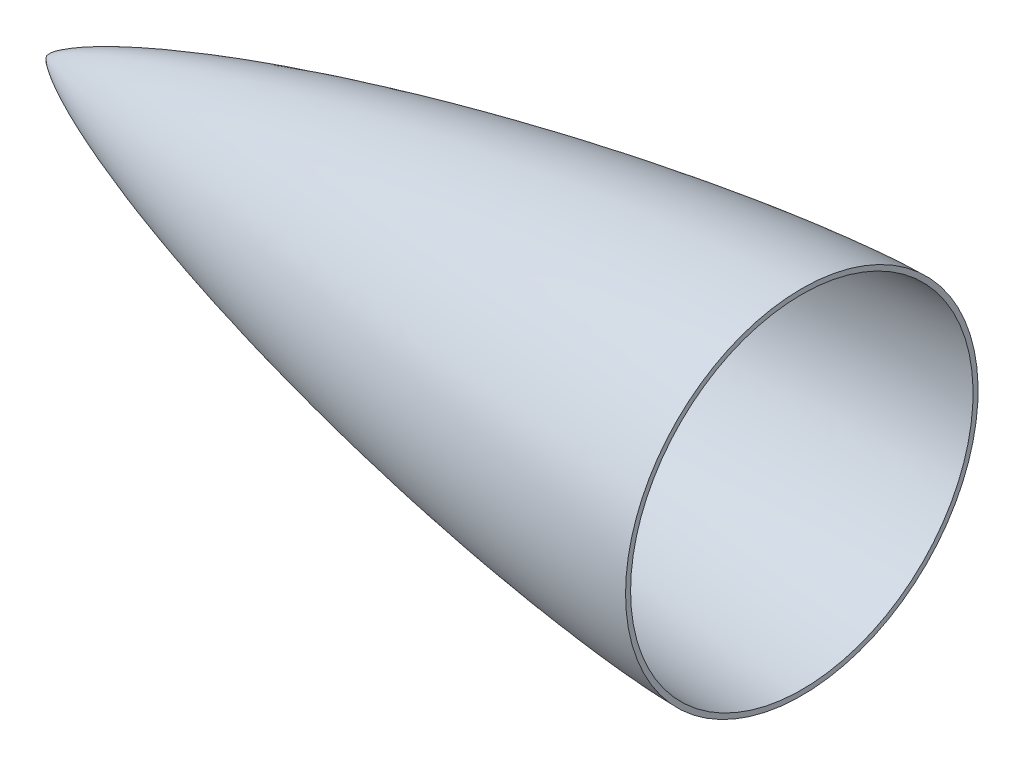
ISO-10303-21;
HEADER;
FILE_DESCRIPTION(('STEP AP214'),'2;1');
FILE_NAME('part.step','',(''),(''),'','','');
FILE_SCHEMA(('AUTOMOTIVE_DESIGN { 1 0 10303 214 1 1 1 1 }'));
ENDSEC;
DATA;
#1=APPLICATION_CONTEXT('core data for automotive mechanical design processes');
#2=APPLICATION_PROTOCOL_DEFINITION('international standard','automotive_design',2000,#1);
#3=PRODUCT_CONTEXT('',#1,'mechanical');
#4=PRODUCT('Part','Part','',(#3));
#5=PRODUCT_RELATED_PRODUCT_CATEGORY('part','',(#4));
#6=PRODUCT_DEFINITION_FORMATION('','',#4);
#7=PRODUCT_DEFINITION_CONTEXT('part definition',#1,'design');
#8=PRODUCT_DEFINITION('design','',#6,#7);
#9=PRODUCT_DEFINITION_SHAPE('','',#8);
#10=(LENGTH_UNIT() NAMED_UNIT(*) SI_UNIT(.MILLI.,.METRE.));
#11=(NAMED_UNIT(*) PLANE_ANGLE_UNIT() SI_UNIT($,.RADIAN.));
#12=(NAMED_UNIT(*) SI_UNIT($,.STERADIAN.) SOLID_ANGLE_UNIT());
#13=UNCERTAINTY_MEASURE_WITH_UNIT(LENGTH_MEASURE(1.E-05),#10,'distance_accuracy_value','');
#14=(GEOMETRIC_REPRESENTATION_CONTEXT(3) GLOBAL_UNCERTAINTY_ASSIGNED_CONTEXT((#13)) GLOBAL_UNIT_ASSIGNED_CONTEXT((#10,
#11,#12)) REPRESENTATION_CONTEXT('',''));
#15=CARTESIAN_POINT('',(0.,0.,0.));
#16=DIRECTION('',(0.,0.,1.));
#17=DIRECTION('',(1.,0.,0.));
#18=AXIS2_PLACEMENT_3D('',#15,#16,#17);
#19=CARTESIAN_POINT('',(150.,35.,0.));
#20=CARTESIAN_POINT('',(149.66664509198,34.9956366081834,0.));
#21=CARTESIAN_POINT('',(148.999834262066,34.9869085023464,0.));
#22=CARTESIAN_POINT('',(147.999859437766,34.9554892253784,0.));
#23=CARTESIAN_POINT('',(146.999855833707,34.9175883855004,0.));
#24=CARTESIAN_POINT('',(145.999858560919,34.8723835604632,0.));
#25=CARTESIAN_POINT('',(144.999859270809,34.8214284782006,0.));
#26=CARTESIAN_POINT('',(143.999860356893,34.7651932964013,0.));
#27=CARTESIAN_POINT('',(142.999861204291,34.7041972137276,0.));
#28=CARTESIAN_POINT('',(141.99986192597,34.6387972135856,0.));
#29=CARTESIAN_POINT('',(140.666346824075,34.5461082976441,0.));
#30=CARTESIAN_POINT('',(139.333015348059,34.4457239440741,0.));
#31=CARTESIAN_POINT('',(137.666350742889,34.3115684943958,0.));
#32=CARTESIAN_POINT('',(135.999461315303,34.1690995551538,0.));
#33=CARTESIAN_POINT('',(133.999464051243,33.9859145798416,0.));
#34=CARTESIAN_POINT('',(131.999466367833,33.7912928258092,0.));
#35=CARTESIAN_POINT('',(129.999467701781,33.5859038154157,0.));
#36=CARTESIAN_POINT('',(127.665825417589,33.3343259425914,0.));
#37=CARTESIAN_POINT('',(124.99880525199,33.0305577925313,0.));
#38=CARTESIAN_POINT('',(121.998802949039,32.6682415340531,0.));
#39=CARTESIAN_POINT('',(118.998798295351,32.2863418939472,0.));
#40=CARTESIAN_POINT('',(115.665008315553,31.841138066842,0.));
#41=CARTESIAN_POINT('',(111.99782653799,31.3257009734582,0.));
#42=CARTESIAN_POINT('',(108.331635507173,30.7822612655152,0.));
#43=CARTESIAN_POINT('',(104.998742544877,30.2665857076717,0.));
#44=CARTESIAN_POINT('',(101.664913182712,29.7325806766687,0.));
#45=CARTESIAN_POINT('',(97.9976756754529,29.1222158121436,0.));
#46=CARTESIAN_POINT('',(93.6636226775506,28.3703937817976,0.));
#47=CARTESIAN_POINT('',(88.6619412220101,27.4635997150922,0.));
#48=CARTESIAN_POINT('',(82.9940899839273,26.3821082443433,0.));
#49=CARTESIAN_POINT('',(77.9963652537716,25.3763984452867,0.));
#50=CARTESIAN_POINT('',(74.6658859192578,24.6797432698292,0.));
#51=CARTESIAN_POINT('',(71.6647306661136,24.0412215852017,0.));
#52=CARTESIAN_POINT('',(68.3293453353301,23.3135631522903,0.));
#53=CARTESIAN_POINT('',(63.9966467217928,22.3321640009038,0.));
#54=CARTESIAN_POINT('',(60.6645990790986,21.5519026045159,0.));
#55=CARTESIAN_POINT('',(57.3311343364555,20.7514387971699,0.));
#56=CARTESIAN_POINT('',(54.3302516931785,20.01253080481,0.));
#57=CARTESIAN_POINT('',(50.66333061131,19.0822607503083,0.));
#58=CARTESIAN_POINT('',(46.995280689283,18.1231379089733,0.));
#59=CARTESIAN_POINT('',(43.3293290989558,17.1298325927866,0.));
#60=CARTESIAN_POINT('',(39.9967815134745,16.1971229601186,0.));
#61=CARTESIAN_POINT('',(36.9964588349201,15.3329310249753,0.));
#62=CARTESIAN_POINT('',(34.3305990578314,14.5417537367693,0.));
#63=CARTESIAN_POINT('',(31.9981125140676,13.8311104466775,0.));
#64=CARTESIAN_POINT('',(29.997950769182,13.2083128683111,0.));
#65=CARTESIAN_POINT('',(27.9977613315776,12.5712190406823,0.));
#66=CARTESIAN_POINT('',(25.9975350626895,11.9188028385088,0.));
#67=CARTESIAN_POINT('',(23.9972640211436,11.249843053521,0.));
#68=CARTESIAN_POINT('',(21.9969322682194,10.5628961590841,0.));
#69=CARTESIAN_POINT('',(20.3313490742211,9.97449843533877,0.));
#70=CARTESIAN_POINT('',(18.9990691446586,9.49294591366331,0.));
#71=CARTESIAN_POINT('',(17.9989992950786,9.12568606609759,0.));
#72=CARTESIAN_POINT('',(16.9989199320501,8.75228061311747,0.));
#73=CARTESIAN_POINT('',(15.9988278263245,8.37232750191442,0.));
#74=CARTESIAN_POINT('',(14.9987219207479,7.98536102861308,0.));
#75=CARTESIAN_POINT('',(13.9985966769532,7.59085427179054,0.));
#76=CARTESIAN_POINT('',(12.9984484708767,7.1881864099034,0.));
#77=CARTESIAN_POINT('',(11.9982704759764,6.77663180134009,0.));
#78=CARTESIAN_POINT('',(10.9980528206473,6.35532817310413,0.));
#79=CARTESIAN_POINT('',(9.99778311943136,5.92323170254295,0.));
#80=CARTESIAN_POINT('',(8.99743902572832,5.4790662047785,0.));
#81=CARTESIAN_POINT('',(7.99699352581599,5.02122104562194,0.));
#82=CARTESIAN_POINT('',(6.9963818175806,4.54764264841753,0.));
#83=CARTESIAN_POINT('',(5.99556472519816,4.05553430535954,0.));
#84=CARTESIAN_POINT('',(4.99417237487804,3.54127276920775,0.));
#85=CARTESIAN_POINT('',(3.99259500034071,2.99847859070526,0.));
#86=CARTESIAN_POINT('',(2.98699057502012,2.42093658721321,0.));
#87=CARTESIAN_POINT('',(1.98524283418259,1.78039134531258,0.));
#88=CARTESIAN_POINT('',(0.901721126559778,1.06035778010876,0.));
#89=CARTESIAN_POINT('',(0.316891894699921,0.372641580751729,0.));
#90=CARTESIAN_POINT('',(0.,0.,0.));
#91=B_SPLINE_CURVE_WITH_KNOTS('',3,(#19,#20,#21,#22,#23,#24,#25,#26,#27,#28,#29,#30,#31,#32,#33,
#34,#35,#36,#37,#38,#39,#40,#41,#42,#43,#44,#45,#46,#47,#48,#49,#50,#51,#52,#53,#54,#55,#56,#57,
#58,#59,#60,#61,#62,#63,#64,#65,#66,#67,#68,#69,#70,#71,#72,#73,#74,#75,#76,#77,#78,#79,#80,#81,
#82,#83,#84,#85,#86,#87,#88,#89,#90),.UNSPECIFIED.,.F.,.F.,(4,1,1,1,1,1,1,1,1,1,1,1,1,1,1,1,1,1,
1,1,1,1,1,1,1,1,1,1,1,1,1,1,1,1,1,1,1,1,1,1,1,1,1,1,1,1,1,1,1,1,1,1,1,1,1,1,1,1,1,1,1,1,1,1,1,1,
1,1,1,4),(0.,0.00644152088395422,0.0128849936905165,0.0193303329679172,0.0257775166745209,
0.0322265284421648,0.0386773546221996,0.0451299830287397,0.0515844029660721,0.0580406053829512,
0.0709583215779572,0.0774198211706869,0.0903480703107852,0.103283285881915,0.116225435734377,
0.129174494578495,0.142130448144729,0.16157728944491,0.181039630696626,0.20051751206699,
0.220011006722719,0.246026810916468,0.272070911844084,0.291622825363021,0.311191139666078,
0.33730820633603,0.363455653122416,0.396184035289021,0.435525476603644,0.474944555864707,
0.494684848451225,0.501269690048879,0.534230918038645,0.560646522114881,0.587106478460496,
0.600354064543841,0.626886721551673,0.646821072824167,0.67345060017499,0.700143110298585,
0.720208087586527,0.740316195346044,0.760471879227052,0.773938066660341,0.78742970636518,
0.800949034782696,0.814498682830901,0.828081793170971,0.841702151448793,0.855364409408748,
0.862213010145848,0.869074378380713,0.875949499006667,0.882839496006671,0.88974567326387,
0.89666954003525,0.903612882244744,0.910577823581419,0.917566925749617,0.924583333349041,
0.93163097052701,0.938714860534164,0.945841602212157,0.953020165738123,0.960263337288227,
0.967590465630993,0.975033555996297,0.9826534626341,0.99060071420356,1.),.UNSPECIFIED.);
#92=CARTESIAN_POINT('',(0.,0.,0.));
#93=DIRECTION('',(-1.,0.,0.));
#94=AXIS1_PLACEMENT('',#92,#93);
#95=SURFACE_OF_REVOLUTION('',#91,#94);
#96=CARTESIAN_POINT('',(0.,0.,0.));
#97=VERTEX_POINT('',#96);
#98=VERTEX_LOOP('',#97);
#99=FACE_BOUND('',#98,.T.);
#100=CARTESIAN_POINT('',(150.,0.,0.));
#101=DIRECTION('',(-1.,0.,0.));
#102=DIRECTION('',(0.,0.,1.));
#103=AXIS2_PLACEMENT_3D('',#100,#101,#102);
#104=CIRCLE('',#103,35.);
#105=CARTESIAN_POINT('',(150.,0.,35.));
#106=VERTEX_POINT('',#105);
#107=EDGE_CURVE('E45',#106,#106,#104,.T.);
#108=ORIENTED_EDGE('',*,*,#107,.T.);
#109=EDGE_LOOP('',(#108));
#110=FACE_BOUND('',#109,.T.);
#111=ADVANCED_FACE('F37',(#99,#110),#95,.T.);
#112=CARTESIAN_POINT('',(1.,0.,0.));
#113=CARTESIAN_POINT('',(1.31738718676485,0.364121805590881,0.));
#114=CARTESIAN_POINT('',(1.90433257291477,1.0374937081135,0.));
#115=CARTESIAN_POINT('',(2.98583018998178,1.73844122357005,0.));
#116=CARTESIAN_POINT('',(3.98741254343056,2.36383169222684,0.));
#117=CARTESIAN_POINT('',(4.99287018284703,2.92751713813757,0.));
#118=CARTESIAN_POINT('',(5.99438457308044,3.45738969719464,0.));
#119=CARTESIAN_POINT('',(6.99573211543783,3.95939380564336,0.));
#120=CARTESIAN_POINT('',(7.99651908146394,4.4397796232403,0.));
#121=CARTESIAN_POINT('',(8.99710958693547,4.90206991416047,0.));
#122=CARTESIAN_POINT('',(9.99753878320898,5.34899853663463,0.));
#123=CARTESIAN_POINT('',(10.9978697682097,5.78256871198413,0.));
#124=CARTESIAN_POINT('',(11.9981297443047,6.20434940273715,0.));
#125=CARTESIAN_POINT('',(12.9983393349875,6.61558836012608,0.));
#126=CARTESIAN_POINT('',(13.9985104809111,7.0173050233454,0.));
#127=CARTESIAN_POINT('',(14.9986528820161,7.41034043024973,0.));
#128=CARTESIAN_POINT('',(15.9987734099887,7.79540193465782,0.));
#129=CARTESIAN_POINT('',(16.9988756108475,8.1730958725704,0.));
#130=CARTESIAN_POINT('',(17.9989634329102,8.54394007810246,0.));
#131=CARTESIAN_POINT('',(18.9990402882333,8.90838311483183,0.));
#132=CARTESIAN_POINT('',(20.331298002624,9.38588475953792,0.));
#133=CARTESIAN_POINT('',(21.9968710212745,9.96876551011091,0.));
#134=CARTESIAN_POINT('',(23.9972257971008,10.6485532706106,0.));
#135=CARTESIAN_POINT('',(25.9975136569233,11.3099448860038,0.));
#136=CARTESIAN_POINT('',(27.9977504289207,11.9544933010757,0.));
#137=CARTESIAN_POINT('',(29.997949274016,12.5834862583982,0.));
#138=CARTESIAN_POINT('',(31.9981167201463,13.1980195073989,0.));
#139=CARTESIAN_POINT('',(34.3306144872102,13.8988825462474,0.));
#140=CARTESIAN_POINT('',(36.9964889903816,14.6787483329227,0.));
#141=CARTESIAN_POINT('',(39.9968201010574,15.5301047402862,0.));
#142=CARTESIAN_POINT('',(42.9970932047072,16.3569629369893,0.));
#143=CARTESIAN_POINT('',(45.9973236809192,17.1608636368338,0.));
#144=CARTESIAN_POINT('',(48.9975187049,17.9431148692742,0.));
#145=CARTESIAN_POINT('',(51.9976860829073,18.7048136936081,0.));
#146=CARTESIAN_POINT('',(55.3303808380797,19.5291527055401,0.));
#147=CARTESIAN_POINT('',(58.6639007609429,20.32932077492,0.));
#148=CARTESIAN_POINT('',(62.3307442823898,21.183933719756,0.));
#149=CARTESIAN_POINT('',(65.6642155503155,21.9383312304838,0.));
#150=CARTESIAN_POINT('',(69.3310152210455,22.7442499026152,0.));
#151=CARTESIAN_POINT('',(72.9971411187127,23.5266558489359,0.));
#152=CARTESIAN_POINT('',(76.9972811151379,24.3519191737266,0.));
#153=CARTESIAN_POINT('',(80.9974018016663,25.1492811929915,0.));
#154=CARTESIAN_POINT('',(85.3301746030327,25.9831316866504,0.));
#155=CARTESIAN_POINT('',(89.9962748358932,26.8453082101766,0.));
#156=CARTESIAN_POINT('',(94.3309809940608,27.6093379624019,0.));
#157=CARTESIAN_POINT('',(97.9987369435186,28.2306451107829,0.));
#158=CARTESIAN_POINT('',(101.331637196154,28.777940863413,0.));
#159=CARTESIAN_POINT('',(104.332069868567,29.2522765331847,0.));
#160=CARTESIAN_POINT('',(107.998271310065,29.8122011710013,0.));
#161=CARTESIAN_POINT('',(111.331187696507,30.3001374720496,0.));
#162=CARTESIAN_POINT('',(114.998831520912,30.8094136036542,0.));
#163=CARTESIAN_POINT('',(117.665849221684,31.164188979585,0.));
#164=CARTESIAN_POINT('',(119.999486283279,31.4628465400129,0.));
#165=CARTESIAN_POINT('',(122.332522106103,31.7517595335914,0.));
#166=CARTESIAN_POINT('',(124.665856209474,32.0282548266759,0.));
#167=CARTESIAN_POINT('',(126.999488399768,32.2916535276673,0.));
#168=CARTESIAN_POINT('',(128.999487991877,32.5080294530844,0.));
#169=CARTESIAN_POINT('',(130.999486826533,32.7146196075917,0.));
#170=CARTESIAN_POINT('',(132.999485034323,32.9109249986988,0.));
#171=CARTESIAN_POINT('',(134.999482685699,33.0963517758367,0.));
#172=CARTESIAN_POINT('',(136.999479757649,33.2701819966592,0.));
#173=CARTESIAN_POINT('',(138.666361281337,33.4046577959232,0.));
#174=CARTESIAN_POINT('',(139.999868432334,33.5054234126985,0.));
#175=CARTESIAN_POINT('',(140.999867792902,33.5774050148465,0.));
#176=CARTESIAN_POINT('',(141.999867172936,33.645598934432,0.));
#177=CARTESIAN_POINT('',(142.999866302864,33.7097684886469,0.));
#178=CARTESIAN_POINT('',(143.999865593254,33.769613382276,0.));
#179=CARTESIAN_POINT('',(144.999864489625,33.8247895836615,0.));
#180=CARTESIAN_POINT('',(145.999863864645,33.8747835569585,0.));
#181=CARTESIAN_POINT('',(146.999861220206,33.9191375654755,0.));
#182=CARTESIAN_POINT('',(147.99986465286,33.9563264868966,0.));
#183=CARTESIAN_POINT('',(148.999840447021,33.9871539467859,0.));
#184=CARTESIAN_POINT('',(149.666645897539,33.9957183986029,0.));
#185=CARTESIAN_POINT('',(150.,34.,0.));
#186=B_SPLINE_CURVE_WITH_KNOTS('',3,(#112,#113,#114,#115,#116,#117,#118,#119,#120,#121,#122,
#123,#124,#125,#126,#127,#128,#129,#130,#131,#132,#133,#134,#135,#136,#137,#138,#139,#140,#141,
#142,#143,#144,#145,#146,#147,#148,#149,#150,#151,#152,#153,#154,#155,#156,#157,#158,#159,#160,
#161,#162,#163,#164,#165,#166,#167,#168,#169,#170,#171,#172,#173,#174,#175,#176,#177,#178,#179,
#180,#181,#182,#183,#184,#185),.UNSPECIFIED.,.F.,.F.,(4,1,1,1,1,1,1,1,1,1,1,1,1,1,1,1,1,1,1,1,1,
1,1,1,1,1,1,1,1,1,1,1,1,1,1,1,1,1,1,1,1,1,1,1,1,1,1,1,1,1,1,1,1,1,1,1,1,1,1,1,1,1,1,1,1,1,1,1,1,
1,1,4),(0.,0.0093573911174049,0.0173046605905687,0.0249350041485754,0.0323943396518676,
0.0397415958511613,0.047007743068123,0.0542114985566762,0.0613652186136958,0.0684775779804371,
0.0755549521920688,0.0826021885886342,0.0896230803779891,0.0966206657328126,0.103597416509648,
0.110555380906419,0.117496284313151,0.124421586815647,0.131332539852141,0.1382302336955,
0.151989521438925,0.165705770194019,0.179383982280031,0.193028199880951,0.206641738673202,
0.220227369348576,0.233787425158505,0.254083848110326,0.274332773248338,0.29453877800456,
0.314705640394945,0.334836531035515,0.354934131432349,0.37500073923864,0.401711387362182,
0.421712934724532,0.44834248523361,0.468286874408982,0.494844412883808,0.521363996940588,
0.547847538294263,0.574296686415538,0.607311903339299,0.640277944566143,0.660034791978776,
0.679775006209378,0.706069960545341,0.719206764517421,0.752018203645874,0.771684388642433,
0.791335256644083,0.80442738429168,0.817512785148456,0.837128315722506,0.850196972977188,
0.863258945486888,0.87631423011415,0.889362815936164,0.902404684048082,0.915439807520788,
0.928468150645813,0.93497976521509,0.941489666472427,0.947997846718856,0.954504297987561,
0.961009009969507,0.967511973069497,0.974013175066367,0.980512603210284,0.987010241428052,
0.993506067914434,1.),.UNSPECIFIED.);
#187=CARTESIAN_POINT('',(0.,0.,0.));
#188=DIRECTION('',(-1.,0.,0.));
#189=AXIS1_PLACEMENT('',#187,#188);
#190=SURFACE_OF_REVOLUTION('',#186,#189);
#191=CARTESIAN_POINT('',(150.,0.,0.));
#192=DIRECTION('',(-1.,0.,0.));
#193=DIRECTION('',(0.,0.,1.));
#194=AXIS2_PLACEMENT_3D('',#191,#192,#193);
#195=CIRCLE('',#194,34.);
#196=CARTESIAN_POINT('',(150.,0.,34.));
#197=VERTEX_POINT('',#196);
#198=EDGE_CURVE('E11',#197,#197,#195,.T.);
#199=ORIENTED_EDGE('',*,*,#198,.F.);
#200=EDGE_LOOP('',(#199));
#201=FACE_BOUND('',#200,.T.);
#202=CARTESIAN_POINT('',(1.,0.,0.));
#203=VERTEX_POINT('',#202);
#204=VERTEX_LOOP('',#203);
#205=FACE_BOUND('',#204,.T.);
#206=ADVANCED_FACE('F53',(#201,#205),#190,.T.);
#207=CARTESIAN_POINT('',(150.,34.,0.));
#208=DIRECTION('',(-1.,0.,0.));
#209=DIRECTION('',(0.,0.,1.));
#210=AXIS2_PLACEMENT_3D('',#207,#208,#209);
#211=PLANE('',#210);
#212=ORIENTED_EDGE('',*,*,#107,.F.);
#213=EDGE_LOOP('',(#212));
#214=FACE_BOUND('',#213,.T.);
#215=ORIENTED_EDGE('',*,*,#198,.T.);
#216=EDGE_LOOP('',(#215));
#217=FACE_BOUND('',#216,.T.);
#218=ADVANCED_FACE('F69',(#214,#217),#211,.F.);
#219=CLOSED_SHELL('',(#111,#206,#218));
#220=MANIFOLD_SOLID_BREP('B2',#219);
#221=ADVANCED_BREP_SHAPE_REPRESENTATION('',(#18,#220),#14);
#222=SHAPE_DEFINITION_REPRESENTATION(#9,#221);
ENDSEC;
END-ISO-10303-21;
